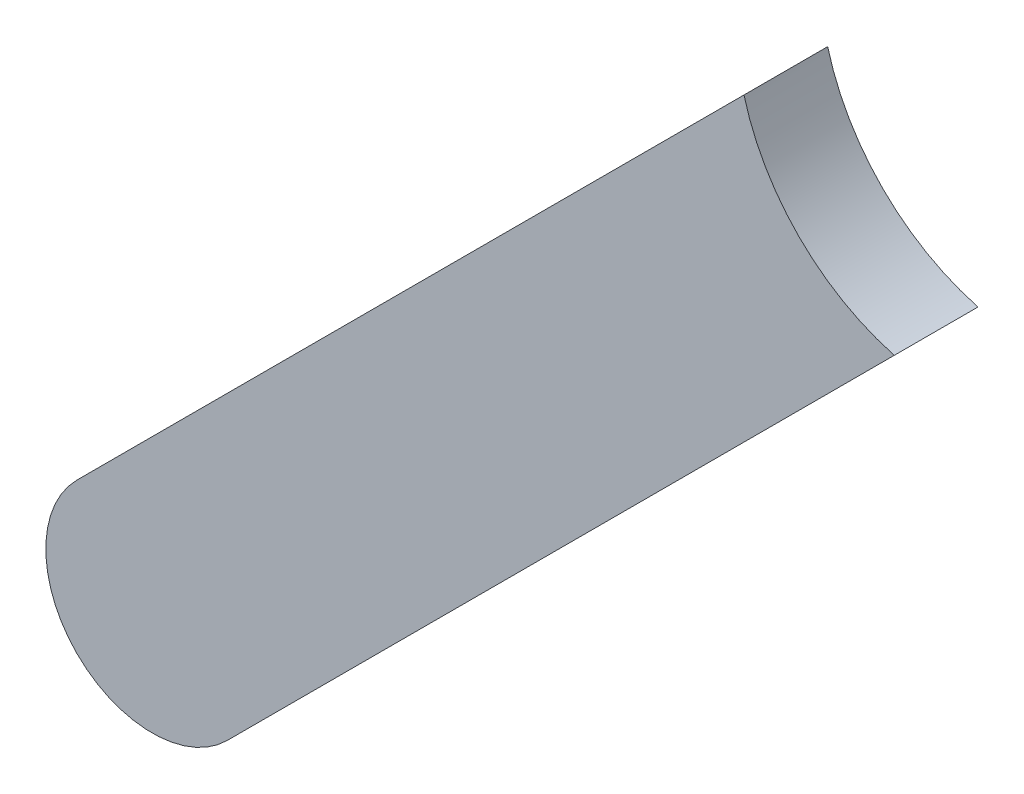
ISO-10303-21;
HEADER;
FILE_DESCRIPTION(('STEP AP214'),'2;1');
FILE_NAME('part.step','',(''),(''),'','','');
FILE_SCHEMA(('AUTOMOTIVE_DESIGN { 1 0 10303 214 1 1 1 1 }'));
ENDSEC;
DATA;
#1=APPLICATION_CONTEXT('core data for automotive mechanical design processes');
#2=APPLICATION_PROTOCOL_DEFINITION('international standard','automotive_design',2000,#1);
#3=PRODUCT_CONTEXT('',#1,'mechanical');
#4=PRODUCT('Part','Part','',(#3));
#5=PRODUCT_RELATED_PRODUCT_CATEGORY('part','',(#4));
#6=PRODUCT_DEFINITION_FORMATION('','',#4);
#7=PRODUCT_DEFINITION_CONTEXT('part definition',#1,'design');
#8=PRODUCT_DEFINITION('design','',#6,#7);
#9=PRODUCT_DEFINITION_SHAPE('','',#8);
#10=(LENGTH_UNIT() NAMED_UNIT(*) SI_UNIT(.MILLI.,.METRE.));
#11=(NAMED_UNIT(*) PLANE_ANGLE_UNIT() SI_UNIT($,.RADIAN.));
#12=(NAMED_UNIT(*) SI_UNIT($,.STERADIAN.) SOLID_ANGLE_UNIT());
#13=UNCERTAINTY_MEASURE_WITH_UNIT(LENGTH_MEASURE(1.E-05),#10,'distance_accuracy_value','');
#14=(GEOMETRIC_REPRESENTATION_CONTEXT(3) GLOBAL_UNCERTAINTY_ASSIGNED_CONTEXT((#13)) GLOBAL_UNIT_ASSIGNED_CONTEXT((#10,
#11,#12)) REPRESENTATION_CONTEXT('',''));
#15=CARTESIAN_POINT('',(0.,0.,0.));
#16=DIRECTION('',(0.,0.,1.));
#17=DIRECTION('',(1.,0.,0.));
#18=AXIS2_PLACEMENT_3D('',#15,#16,#17);
#19=CARTESIAN_POINT('',(88.44460594,58.14991926,0.));
#20=DIRECTION('',(-0.707106781186548,0.707106781186548,0.));
#21=DIRECTION('',(0.707106781186548,0.707106781186548,0.));
#22=AXIS2_PLACEMENT_3D('',#19,#20,#21);
#23=PLANE('',#22);
#24=DIRECTION('',(0.707106781186548,0.707106781186548,0.));
#25=VECTOR('',#24,1.);
#26=CARTESIAN_POINT('',(88.44460594,58.14991926,0.1999996));
#27=LINE('',#26,#25);
#28=CARTESIAN_POINT('',(88.44460594,58.14991926,0.1999996));
#29=VERTEX_POINT('',#28);
#30=CARTESIAN_POINT('',(90.0385212146972,59.7438345346972,0.1999996));
#31=VERTEX_POINT('',#30);
#32=EDGE_CURVE('E11',#29,#31,#27,.T.);
#33=ORIENTED_EDGE('',*,*,#32,.F.);
#34=DIRECTION('',(0.,0.,1.));
#35=VECTOR('',#34,1.);
#36=CARTESIAN_POINT('',(88.44460594,58.14991926,0.));
#37=LINE('',#36,#35);
#38=CARTESIAN_POINT('',(88.44460594,58.14991926,0.));
#39=VERTEX_POINT('',#38);
#40=EDGE_CURVE('E24',#39,#29,#37,.T.);
#41=ORIENTED_EDGE('',*,*,#40,.F.);
#42=DIRECTION('',(0.707106781186548,0.707106781186548,0.));
#43=VECTOR('',#42,1.);
#44=CARTESIAN_POINT('',(88.44460594,58.14991926,0.));
#45=LINE('',#44,#43);
#46=CARTESIAN_POINT('',(90.0385212146972,59.7438345346972,0.));
#47=VERTEX_POINT('',#46);
#48=EDGE_CURVE('E75',#39,#47,#45,.T.);
#49=ORIENTED_EDGE('',*,*,#48,.T.);
#50=DIRECTION('',(0.,0.,1.));
#51=VECTOR('',#50,1.);
#52=CARTESIAN_POINT('',(90.0385212146972,59.7438345346972,0.));
#53=LINE('',#52,#51);
#54=EDGE_CURVE('E37',#47,#31,#53,.T.);
#55=ORIENTED_EDGE('',*,*,#54,.T.);
#56=EDGE_LOOP('',(#33,#41,#49,#55));
#57=FACE_BOUND('',#56,.T.);
#58=ADVANCED_FACE('F17',(#57),#23,.F.);
#59=CARTESIAN_POINT('',(90.17,60.2345252,0.));
#60=DIRECTION('',(0.,0.,-1.));
#61=DIRECTION('',(1.,0.,0.));
#62=AXIS2_PLACEMENT_3D('',#59,#60,#61);
#63=CYLINDRICAL_SURFACE('',#62,0.508);
#64=DIRECTION('',(0.,0.,1.));
#65=VECTOR('',#64,1.);
#66=CARTESIAN_POINT('',(89.6793093346972,60.1030464146972,0.));
#67=LINE('',#66,#65);
#68=CARTESIAN_POINT('',(89.6793093346972,60.1030464146972,0.));
#69=VERTEX_POINT('',#68);
#70=CARTESIAN_POINT('',(89.6793093346972,60.1030464146972,0.1999996));
#71=VERTEX_POINT('',#70);
#72=EDGE_CURVE('E67',#69,#71,#67,.T.);
#73=ORIENTED_EDGE('',*,*,#72,.T.);
#74=CARTESIAN_POINT('',(90.17,60.2345252,0.1999996));
#75=DIRECTION('',(0.,0.,1.));
#76=DIRECTION('',(1.,0.,0.));
#77=AXIS2_PLACEMENT_3D('',#74,#75,#76);
#78=CIRCLE('',#77,0.508);
#79=EDGE_CURVE('E82',#71,#31,#78,.T.);
#80=ORIENTED_EDGE('',*,*,#79,.T.);
#81=ORIENTED_EDGE('',*,*,#54,.F.);
#82=CARTESIAN_POINT('',(90.17,60.2345252,0.));
#83=DIRECTION('',(0.,0.,1.));
#84=DIRECTION('',(1.,0.,0.));
#85=AXIS2_PLACEMENT_3D('',#82,#83,#84);
#86=CIRCLE('',#85,0.508);
#87=EDGE_CURVE('E80',#69,#47,#86,.T.);
#88=ORIENTED_EDGE('',*,*,#87,.F.);
#89=EDGE_LOOP('',(#73,#80,#81,#88));
#90=FACE_BOUND('',#89,.T.);
#91=ADVANCED_FACE('F88',(#90),#63,.F.);
#92=CARTESIAN_POINT('',(89.6793093346972,60.1030464146972,0.));
#93=DIRECTION('',(0.707106781186548,-0.707106781186548,0.));
#94=DIRECTION('',(-0.707106781186548,-0.707106781186548,0.));
#95=AXIS2_PLACEMENT_3D('',#92,#93,#94);
#96=PLANE('',#95);
#97=DIRECTION('',(-0.707106781186548,-0.707106781186548,0.));
#98=VECTOR('',#97,1.);
#99=CARTESIAN_POINT('',(89.99039406,60.41413114,0.1999996));
#100=LINE('',#99,#98);
#101=CARTESIAN_POINT('',(88.08539406,58.50913114,0.1999996));
#102=VERTEX_POINT('',#101);
#103=EDGE_CURVE('E71',#71,#102,#100,.T.);
#104=ORIENTED_EDGE('',*,*,#103,.F.);
#105=ORIENTED_EDGE('',*,*,#72,.F.);
#106=DIRECTION('',(-0.707106781186548,-0.707106781186548,0.));
#107=VECTOR('',#106,1.);
#108=CARTESIAN_POINT('',(89.99039406,60.41413114,0.));
#109=LINE('',#108,#107);
#110=CARTESIAN_POINT('',(88.08539406,58.50913114,0.));
#111=VERTEX_POINT('',#110);
#112=EDGE_CURVE('E63',#69,#111,#109,.T.);
#113=ORIENTED_EDGE('',*,*,#112,.T.);
#114=DIRECTION('',(0.,0.,1.));
#115=VECTOR('',#114,1.);
#116=CARTESIAN_POINT('',(88.08539406,58.50913114,0.));
#117=LINE('',#116,#115);
#118=EDGE_CURVE('E53',#111,#102,#117,.T.);
#119=ORIENTED_EDGE('',*,*,#118,.T.);
#120=EDGE_LOOP('',(#104,#105,#113,#119));
#121=FACE_BOUND('',#120,.T.);
#122=ADVANCED_FACE('F66',(#121),#96,.F.);
#123=CARTESIAN_POINT('',(88.265,58.3295252,0.));
#124=DIRECTION('',(0.,0.,-1.));
#125=DIRECTION('',(-0.70710678118652,0.707106781186576,0.));
#126=AXIS2_PLACEMENT_3D('',#123,#124,#125);
#127=CYLINDRICAL_SURFACE('',#126,0.254001156230764);
#128=CARTESIAN_POINT('',(88.265,58.3295252,0.1999996));
#129=DIRECTION('',(0.,0.,1.));
#130=DIRECTION('',(-0.70710678118652,0.707106781186576,0.));
#131=AXIS2_PLACEMENT_3D('',#128,#129,#130);
#132=CIRCLE('',#131,0.254001156230764);
#133=EDGE_CURVE('E59',#102,#29,#132,.T.);
#134=ORIENTED_EDGE('',*,*,#133,.F.);
#135=ORIENTED_EDGE('',*,*,#118,.F.);
#136=CARTESIAN_POINT('',(88.265,58.3295252,0.));
#137=DIRECTION('',(0.,0.,1.));
#138=DIRECTION('',(-0.70710678118652,0.707106781186576,0.));
#139=AXIS2_PLACEMENT_3D('',#136,#137,#138);
#140=CIRCLE('',#139,0.254001156230764);
#141=EDGE_CURVE('E57',#111,#39,#140,.T.);
#142=ORIENTED_EDGE('',*,*,#141,.T.);
#143=ORIENTED_EDGE('',*,*,#40,.T.);
#144=EDGE_LOOP('',(#134,#135,#142,#143));
#145=FACE_BOUND('',#144,.T.);
#146=ADVANCED_FACE('F55',(#145),#127,.T.);
#147=CARTESIAN_POINT('',(88.44460594,58.14991926,0.));
#148=DIRECTION('',(0.,0.,-1.));
#149=DIRECTION('',(-1.,0.,0.));
#150=AXIS2_PLACEMENT_3D('',#147,#148,#149);
#151=PLANE('',#150);
#152=ORIENTED_EDGE('',*,*,#48,.F.);
#153=ORIENTED_EDGE('',*,*,#141,.F.);
#154=ORIENTED_EDGE('',*,*,#112,.F.);
#155=ORIENTED_EDGE('',*,*,#87,.T.);
#156=EDGE_LOOP('',(#152,#153,#154,#155));
#157=FACE_BOUND('',#156,.T.);
#158=ADVANCED_FACE('F74',(#157),#151,.T.);
#159=CARTESIAN_POINT('',(88.44460594,58.14991926,0.1999996));
#160=DIRECTION('',(0.,0.,-1.));
#161=DIRECTION('',(-1.,0.,0.));
#162=AXIS2_PLACEMENT_3D('',#159,#160,#161);
#163=PLANE('',#162);
#164=ORIENTED_EDGE('',*,*,#133,.T.);
#165=ORIENTED_EDGE('',*,*,#32,.T.);
#166=ORIENTED_EDGE('',*,*,#79,.F.);
#167=ORIENTED_EDGE('',*,*,#103,.T.);
#168=EDGE_LOOP('',(#164,#165,#166,#167));
#169=FACE_BOUND('',#168,.T.);
#170=ADVANCED_FACE('F91',(#169),#163,.F.);
#171=CLOSED_SHELL('',(#58,#91,#122,#146,#158,#170));
#172=MANIFOLD_SOLID_BREP('B1',#171);
#173=ADVANCED_BREP_SHAPE_REPRESENTATION('',(#18,#172),#14);
#174=SHAPE_DEFINITION_REPRESENTATION(#9,#173);
ENDSEC;
END-ISO-10303-21;
